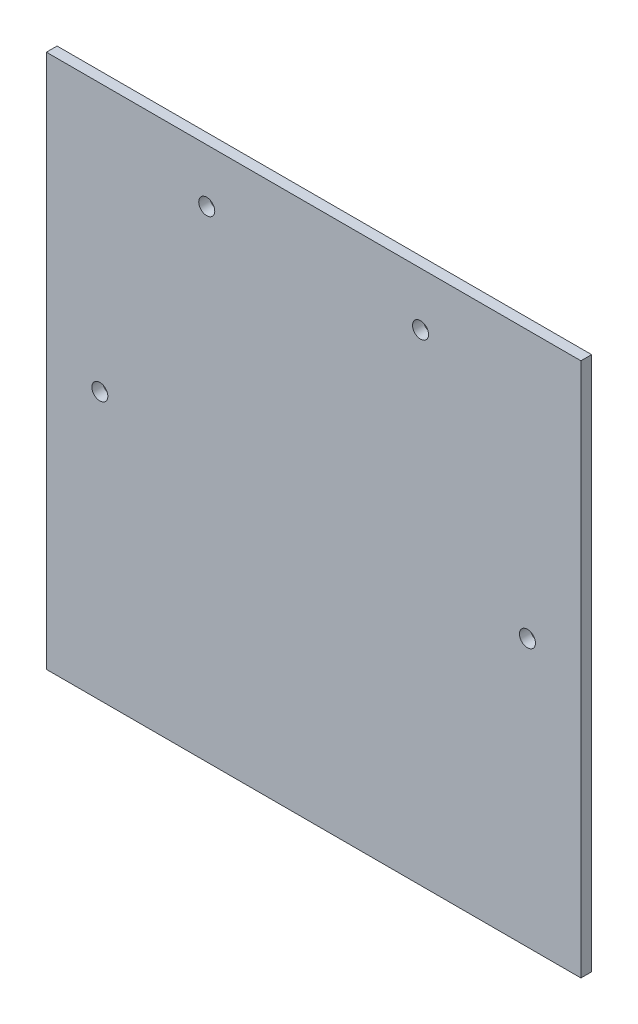
ISO-10303-21;
HEADER;
FILE_DESCRIPTION(('STEP AP214'),'2;1');
FILE_NAME('part.step','',(''),(''),'','','');
FILE_SCHEMA(('AUTOMOTIVE_DESIGN { 1 0 10303 214 1 1 1 1 }'));
ENDSEC;
DATA;
#1=APPLICATION_CONTEXT('core data for automotive mechanical design processes');
#2=APPLICATION_PROTOCOL_DEFINITION('international standard','automotive_design',2000,#1);
#3=PRODUCT_CONTEXT('',#1,'mechanical');
#4=PRODUCT('Part','Part','',(#3));
#5=PRODUCT_RELATED_PRODUCT_CATEGORY('part','',(#4));
#6=PRODUCT_DEFINITION_FORMATION('','',#4);
#7=PRODUCT_DEFINITION_CONTEXT('part definition',#1,'design');
#8=PRODUCT_DEFINITION('design','',#6,#7);
#9=PRODUCT_DEFINITION_SHAPE('','',#8);
#10=(LENGTH_UNIT() NAMED_UNIT(*) SI_UNIT(.MILLI.,.METRE.));
#11=(NAMED_UNIT(*) PLANE_ANGLE_UNIT() SI_UNIT($,.RADIAN.));
#12=(NAMED_UNIT(*) SI_UNIT($,.STERADIAN.) SOLID_ANGLE_UNIT());
#13=UNCERTAINTY_MEASURE_WITH_UNIT(LENGTH_MEASURE(1.E-05),#10,'distance_accuracy_value','');
#14=(GEOMETRIC_REPRESENTATION_CONTEXT(3) GLOBAL_UNCERTAINTY_ASSIGNED_CONTEXT((#13)) GLOBAL_UNIT_ASSIGNED_CONTEXT((#10,
#11,#12)) REPRESENTATION_CONTEXT('',''));
#15=CARTESIAN_POINT('',(0.,0.,0.));
#16=DIRECTION('',(0.,0.,1.));
#17=DIRECTION('',(1.,0.,0.));
#18=AXIS2_PLACEMENT_3D('',#15,#16,#17);
#19=CARTESIAN_POINT('',(50.,50.,2.));
#20=DIRECTION('',(0.,0.,-1.));
#21=DIRECTION('',(-1.,0.,0.));
#22=AXIS2_PLACEMENT_3D('',#19,#20,#21);
#23=PLANE('',#22);
#24=DIRECTION('',(0.,1.,0.));
#25=VECTOR('',#24,1.);
#26=CARTESIAN_POINT('',(50.,-50.,2.));
#27=LINE('',#26,#25);
#28=CARTESIAN_POINT('',(50.,-50.,2.));
#29=VERTEX_POINT('',#28);
#30=CARTESIAN_POINT('',(50.,50.,2.));
#31=VERTEX_POINT('',#30);
#32=EDGE_CURVE('E86',#29,#31,#27,.T.);
#33=ORIENTED_EDGE('',*,*,#32,.T.);
#34=DIRECTION('',(-1.,0.,0.));
#35=VECTOR('',#34,1.);
#36=CARTESIAN_POINT('',(-50.,50.,2.));
#37=LINE('',#36,#35);
#38=CARTESIAN_POINT('',(-50.,50.,2.));
#39=VERTEX_POINT('',#38);
#40=EDGE_CURVE('E81',#31,#39,#37,.T.);
#41=ORIENTED_EDGE('',*,*,#40,.T.);
#42=DIRECTION('',(0.,-1.,0.));
#43=VECTOR('',#42,1.);
#44=CARTESIAN_POINT('',(-50.,-50.,2.));
#45=LINE('',#44,#43);
#46=CARTESIAN_POINT('',(-50.,-50.,2.));
#47=VERTEX_POINT('',#46);
#48=EDGE_CURVE('E84',#39,#47,#45,.T.);
#49=ORIENTED_EDGE('',*,*,#48,.T.);
#50=DIRECTION('',(1.,0.,0.));
#51=VECTOR('',#50,1.);
#52=CARTESIAN_POINT('',(-50.,-50.,2.));
#53=LINE('',#52,#51);
#54=EDGE_CURVE('E51',#47,#29,#53,.T.);
#55=ORIENTED_EDGE('',*,*,#54,.T.);
#56=EDGE_LOOP('',(#33,#41,#49,#55));
#57=FACE_BOUND('',#56,.T.);
#58=CARTESIAN_POINT('',(-20.,40.,2.));
#59=DIRECTION('',(0.,0.,1.));
#60=DIRECTION('',(1.,0.,0.));
#61=AXIS2_PLACEMENT_3D('',#58,#59,#60);
#62=CIRCLE('',#61,1.5);
#63=CARTESIAN_POINT('',(-18.5,40.,2.));
#64=VERTEX_POINT('',#63);
#65=EDGE_CURVE('E110',#64,#64,#62,.T.);
#66=ORIENTED_EDGE('',*,*,#65,.F.);
#67=EDGE_LOOP('',(#66));
#68=FACE_BOUND('',#67,.T.);
#69=CARTESIAN_POINT('',(20.,40.,2.));
#70=DIRECTION('',(0.,0.,1.));
#71=DIRECTION('',(1.,0.,0.));
#72=AXIS2_PLACEMENT_3D('',#69,#70,#71);
#73=CIRCLE('',#72,1.5);
#74=CARTESIAN_POINT('',(21.5,40.,2.));
#75=VERTEX_POINT('',#74);
#76=EDGE_CURVE('E113',#75,#75,#73,.T.);
#77=ORIENTED_EDGE('',*,*,#76,.F.);
#78=EDGE_LOOP('',(#77));
#79=FACE_BOUND('',#78,.T.);
#80=CARTESIAN_POINT('',(-40.,0.,2.));
#81=DIRECTION('',(0.,0.,1.));
#82=DIRECTION('',(1.,0.,0.));
#83=AXIS2_PLACEMENT_3D('',#80,#81,#82);
#84=CIRCLE('',#83,1.5);
#85=CARTESIAN_POINT('',(-38.5,0.,2.));
#86=VERTEX_POINT('',#85);
#87=EDGE_CURVE('E116',#86,#86,#84,.T.);
#88=ORIENTED_EDGE('',*,*,#87,.F.);
#89=EDGE_LOOP('',(#88));
#90=FACE_BOUND('',#89,.T.);
#91=CARTESIAN_POINT('',(40.,0.,2.));
#92=DIRECTION('',(0.,0.,-1.));
#93=DIRECTION('',(-1.,0.,0.));
#94=AXIS2_PLACEMENT_3D('',#91,#92,#93);
#95=CIRCLE('',#94,1.5);
#96=CARTESIAN_POINT('',(38.5,0.,2.));
#97=VERTEX_POINT('',#96);
#98=EDGE_CURVE('E126',#97,#97,#95,.T.);
#99=ORIENTED_EDGE('',*,*,#98,.T.);
#100=EDGE_LOOP('',(#99));
#101=FACE_BOUND('',#100,.T.);
#102=ADVANCED_FACE('F32',(#57,#68,#79,#90,#101),#23,.F.);
#103=CARTESIAN_POINT('',(50.,50.,0.));
#104=DIRECTION('',(0.,0.,-1.));
#105=DIRECTION('',(-1.,0.,0.));
#106=AXIS2_PLACEMENT_3D('',#103,#104,#105);
#107=PLANE('',#106);
#108=DIRECTION('',(0.,1.,0.));
#109=VECTOR('',#108,1.);
#110=CARTESIAN_POINT('',(50.,-50.,0.));
#111=LINE('',#110,#109);
#112=CARTESIAN_POINT('',(50.,-50.,0.));
#113=VERTEX_POINT('',#112);
#114=CARTESIAN_POINT('',(50.,50.,0.));
#115=VERTEX_POINT('',#114);
#116=EDGE_CURVE('E99',#113,#115,#111,.T.);
#117=ORIENTED_EDGE('',*,*,#116,.F.);
#118=DIRECTION('',(1.,0.,0.));
#119=VECTOR('',#118,1.);
#120=CARTESIAN_POINT('',(-50.,-50.,0.));
#121=LINE('',#120,#119);
#122=CARTESIAN_POINT('',(-50.,-50.,0.));
#123=VERTEX_POINT('',#122);
#124=EDGE_CURVE('E74',#123,#113,#121,.T.);
#125=ORIENTED_EDGE('',*,*,#124,.F.);
#126=DIRECTION('',(0.,-1.,0.));
#127=VECTOR('',#126,1.);
#128=CARTESIAN_POINT('',(-50.,-50.,0.));
#129=LINE('',#128,#127);
#130=CARTESIAN_POINT('',(-50.,50.,0.));
#131=VERTEX_POINT('',#130);
#132=EDGE_CURVE('E68',#131,#123,#129,.T.);
#133=ORIENTED_EDGE('',*,*,#132,.F.);
#134=DIRECTION('',(-1.,0.,0.));
#135=VECTOR('',#134,1.);
#136=CARTESIAN_POINT('',(-50.,50.,0.));
#137=LINE('',#136,#135);
#138=EDGE_CURVE('E90',#115,#131,#137,.T.);
#139=ORIENTED_EDGE('',*,*,#138,.F.);
#140=EDGE_LOOP('',(#117,#125,#133,#139));
#141=FACE_BOUND('',#140,.T.);
#142=CARTESIAN_POINT('',(-20.,40.,0.));
#143=DIRECTION('',(0.,0.,-1.));
#144=DIRECTION('',(-1.,0.,0.));
#145=AXIS2_PLACEMENT_3D('',#142,#143,#144);
#146=CIRCLE('',#145,1.5);
#147=CARTESIAN_POINT('',(-21.5,40.,0.));
#148=VERTEX_POINT('',#147);
#149=EDGE_CURVE('E102',#148,#148,#146,.T.);
#150=ORIENTED_EDGE('',*,*,#149,.F.);
#151=EDGE_LOOP('',(#150));
#152=FACE_BOUND('',#151,.T.);
#153=CARTESIAN_POINT('',(20.,40.,0.));
#154=DIRECTION('',(0.,0.,-1.));
#155=DIRECTION('',(-1.,0.,0.));
#156=AXIS2_PLACEMENT_3D('',#153,#154,#155);
#157=CIRCLE('',#156,1.5);
#158=CARTESIAN_POINT('',(18.5,40.,0.));
#159=VERTEX_POINT('',#158);
#160=EDGE_CURVE('E111',#159,#159,#157,.T.);
#161=ORIENTED_EDGE('',*,*,#160,.F.);
#162=EDGE_LOOP('',(#161));
#163=FACE_BOUND('',#162,.T.);
#164=CARTESIAN_POINT('',(-40.,0.,0.));
#165=DIRECTION('',(0.,0.,-1.));
#166=DIRECTION('',(-1.,0.,0.));
#167=AXIS2_PLACEMENT_3D('',#164,#165,#166);
#168=CIRCLE('',#167,1.5);
#169=CARTESIAN_POINT('',(-41.5,0.,0.));
#170=VERTEX_POINT('',#169);
#171=EDGE_CURVE('E114',#170,#170,#168,.T.);
#172=ORIENTED_EDGE('',*,*,#171,.F.);
#173=EDGE_LOOP('',(#172));
#174=FACE_BOUND('',#173,.T.);
#175=CARTESIAN_POINT('',(40.,0.,0.));
#176=DIRECTION('',(0.,0.,-1.));
#177=DIRECTION('',(-1.,0.,0.));
#178=AXIS2_PLACEMENT_3D('',#175,#176,#177);
#179=CIRCLE('',#178,1.5);
#180=CARTESIAN_POINT('',(38.5,0.,0.));
#181=VERTEX_POINT('',#180);
#182=EDGE_CURVE('E36',#181,#181,#179,.F.);
#183=ORIENTED_EDGE('',*,*,#182,.T.);
#184=EDGE_LOOP('',(#183));
#185=FACE_BOUND('',#184,.T.);
#186=ADVANCED_FACE('F135',(#141,#152,#163,#174,#185),#107,.T.);
#187=CARTESIAN_POINT('',(50.,-50.,2.));
#188=DIRECTION('',(-1.,0.,0.));
#189=DIRECTION('',(0.,0.,1.));
#190=AXIS2_PLACEMENT_3D('',#187,#188,#189);
#191=PLANE('',#190);
#192=ORIENTED_EDGE('',*,*,#116,.T.);
#193=DIRECTION('',(0.,0.,-1.));
#194=VECTOR('',#193,1.);
#195=CARTESIAN_POINT('',(50.,50.,2.));
#196=LINE('',#195,#194);
#197=EDGE_CURVE('E11',#31,#115,#196,.T.);
#198=ORIENTED_EDGE('',*,*,#197,.F.);
#199=ORIENTED_EDGE('',*,*,#32,.F.);
#200=DIRECTION('',(0.,0.,-1.));
#201=VECTOR('',#200,1.);
#202=CARTESIAN_POINT('',(50.,-50.,2.));
#203=LINE('',#202,#201);
#204=EDGE_CURVE('E95',#29,#113,#203,.T.);
#205=ORIENTED_EDGE('',*,*,#204,.T.);
#206=EDGE_LOOP('',(#192,#198,#199,#205));
#207=FACE_BOUND('',#206,.T.);
#208=ADVANCED_FACE('F34',(#207),#191,.F.);
#209=CARTESIAN_POINT('',(-50.,50.,2.));
#210=DIRECTION('',(0.,-1.,0.));
#211=DIRECTION('',(0.,0.,-1.));
#212=AXIS2_PLACEMENT_3D('',#209,#210,#211);
#213=PLANE('',#212);
#214=ORIENTED_EDGE('',*,*,#138,.T.);
#215=DIRECTION('',(0.,0.,-1.));
#216=VECTOR('',#215,1.);
#217=CARTESIAN_POINT('',(-50.,50.,2.));
#218=LINE('',#217,#216);
#219=EDGE_CURVE('E42',#39,#131,#218,.T.);
#220=ORIENTED_EDGE('',*,*,#219,.F.);
#221=ORIENTED_EDGE('',*,*,#40,.F.);
#222=ORIENTED_EDGE('',*,*,#197,.T.);
#223=EDGE_LOOP('',(#214,#220,#221,#222));
#224=FACE_BOUND('',#223,.T.);
#225=ADVANCED_FACE('F89',(#224),#213,.F.);
#226=CARTESIAN_POINT('',(-50.,-50.,2.));
#227=DIRECTION('',(1.,0.,0.));
#228=DIRECTION('',(0.,0.,-1.));
#229=AXIS2_PLACEMENT_3D('',#226,#227,#228);
#230=PLANE('',#229);
#231=ORIENTED_EDGE('',*,*,#132,.T.);
#232=DIRECTION('',(0.,0.,-1.));
#233=VECTOR('',#232,1.);
#234=CARTESIAN_POINT('',(-50.,-50.,2.));
#235=LINE('',#234,#233);
#236=EDGE_CURVE('E91',#47,#123,#235,.T.);
#237=ORIENTED_EDGE('',*,*,#236,.F.);
#238=ORIENTED_EDGE('',*,*,#48,.F.);
#239=ORIENTED_EDGE('',*,*,#219,.T.);
#240=EDGE_LOOP('',(#231,#237,#238,#239));
#241=FACE_BOUND('',#240,.T.);
#242=ADVANCED_FACE('F93',(#241),#230,.F.);
#243=CARTESIAN_POINT('',(-50.,-50.,2.));
#244=DIRECTION('',(0.,1.,0.));
#245=DIRECTION('',(0.,0.,1.));
#246=AXIS2_PLACEMENT_3D('',#243,#244,#245);
#247=PLANE('',#246);
#248=ORIENTED_EDGE('',*,*,#124,.T.);
#249=ORIENTED_EDGE('',*,*,#204,.F.);
#250=ORIENTED_EDGE('',*,*,#54,.F.);
#251=ORIENTED_EDGE('',*,*,#236,.T.);
#252=EDGE_LOOP('',(#248,#249,#250,#251));
#253=FACE_BOUND('',#252,.T.);
#254=ADVANCED_FACE('F159',(#253),#247,.F.);
#255=CARTESIAN_POINT('',(-20.,40.,-8.));
#256=DIRECTION('',(0.,0.,1.));
#257=DIRECTION('',(1.,0.,0.));
#258=AXIS2_PLACEMENT_3D('',#255,#256,#257);
#259=CYLINDRICAL_SURFACE('',#258,1.5);
#260=ORIENTED_EDGE('',*,*,#149,.T.);
#261=EDGE_LOOP('',(#260));
#262=FACE_BOUND('',#261,.T.);
#263=ORIENTED_EDGE('',*,*,#65,.T.);
#264=EDGE_LOOP('',(#263));
#265=FACE_BOUND('',#264,.T.);
#266=ADVANCED_FACE('F132',(#262,#265),#259,.F.);
#267=CARTESIAN_POINT('',(20.,40.,-8.));
#268=DIRECTION('',(0.,0.,1.));
#269=DIRECTION('',(1.,0.,0.));
#270=AXIS2_PLACEMENT_3D('',#267,#268,#269);
#271=CYLINDRICAL_SURFACE('',#270,1.5);
#272=ORIENTED_EDGE('',*,*,#160,.T.);
#273=EDGE_LOOP('',(#272));
#274=FACE_BOUND('',#273,.T.);
#275=ORIENTED_EDGE('',*,*,#76,.T.);
#276=EDGE_LOOP('',(#275));
#277=FACE_BOUND('',#276,.T.);
#278=ADVANCED_FACE('F151',(#274,#277),#271,.F.);
#279=CARTESIAN_POINT('',(-40.,0.,-8.));
#280=DIRECTION('',(0.,0.,1.));
#281=DIRECTION('',(1.,0.,0.));
#282=AXIS2_PLACEMENT_3D('',#279,#280,#281);
#283=CYLINDRICAL_SURFACE('',#282,1.5);
#284=ORIENTED_EDGE('',*,*,#171,.T.);
#285=EDGE_LOOP('',(#284));
#286=FACE_BOUND('',#285,.T.);
#287=ORIENTED_EDGE('',*,*,#87,.T.);
#288=EDGE_LOOP('',(#287));
#289=FACE_BOUND('',#288,.T.);
#290=ADVANCED_FACE('F145',(#286,#289),#283,.F.);
#291=CARTESIAN_POINT('',(40.,0.,-8.));
#292=DIRECTION('',(0.,0.,1.));
#293=DIRECTION('',(1.,0.,0.));
#294=AXIS2_PLACEMENT_3D('',#291,#292,#293);
#295=CYLINDRICAL_SURFACE('',#294,1.5);
#296=ORIENTED_EDGE('',*,*,#182,.F.);
#297=EDGE_LOOP('',(#296));
#298=FACE_BOUND('',#297,.T.);
#299=ORIENTED_EDGE('',*,*,#98,.F.);
#300=EDGE_LOOP('',(#299));
#301=FACE_BOUND('',#300,.T.);
#302=ADVANCED_FACE('F143',(#298,#301),#295,.F.);
#303=CLOSED_SHELL('',(#102,#186,#208,#225,#242,#254,#266,#278,#290,#302));
#304=MANIFOLD_SOLID_BREP('B2',#303);
#305=ADVANCED_BREP_SHAPE_REPRESENTATION('',(#18,#304),#14);
#306=SHAPE_DEFINITION_REPRESENTATION(#9,#305);
ENDSEC;
END-ISO-10303-21;
